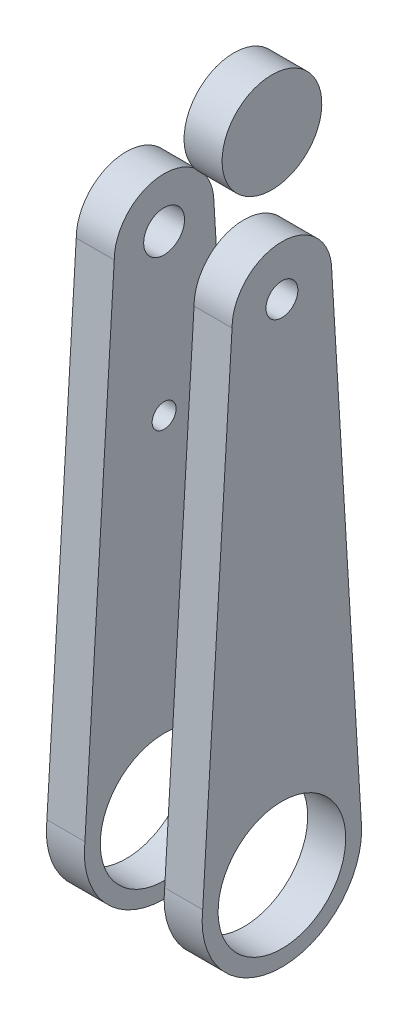
ISO-10303-21;
HEADER;
FILE_DESCRIPTION(('STEP AP214'),'2;1');
FILE_NAME('part.step','',(''),(''),'','','');
FILE_SCHEMA(('AUTOMOTIVE_DESIGN { 1 0 10303 214 1 1 1 1 }'));
ENDSEC;
DATA;
#1=APPLICATION_CONTEXT('core data for automotive mechanical design processes');
#2=APPLICATION_PROTOCOL_DEFINITION('international standard','automotive_design',2000,#1);
#3=PRODUCT_CONTEXT('',#1,'mechanical');
#4=PRODUCT('Part','Part','',(#3));
#5=PRODUCT_RELATED_PRODUCT_CATEGORY('part','',(#4));
#6=PRODUCT_DEFINITION_FORMATION('','',#4);
#7=PRODUCT_DEFINITION_CONTEXT('part definition',#1,'design');
#8=PRODUCT_DEFINITION('design','',#6,#7);
#9=PRODUCT_DEFINITION_SHAPE('','',#8);
#10=(LENGTH_UNIT() NAMED_UNIT(*) SI_UNIT(.MILLI.,.METRE.));
#11=(NAMED_UNIT(*) PLANE_ANGLE_UNIT() SI_UNIT($,.RADIAN.));
#12=(NAMED_UNIT(*) SI_UNIT($,.STERADIAN.) SOLID_ANGLE_UNIT());
#13=UNCERTAINTY_MEASURE_WITH_UNIT(LENGTH_MEASURE(1.E-05),#10,'distance_accuracy_value','');
#14=(GEOMETRIC_REPRESENTATION_CONTEXT(3) GLOBAL_UNCERTAINTY_ASSIGNED_CONTEXT((#13)) GLOBAL_UNIT_ASSIGNED_CONTEXT((#10,
#11,#12)) REPRESENTATION_CONTEXT('',''));
#15=CARTESIAN_POINT('',(0.,0.,0.));
#16=DIRECTION('',(0.,0.,1.));
#17=DIRECTION('',(1.,0.,0.));
#18=AXIS2_PLACEMENT_3D('',#15,#16,#17);
#19=CARTESIAN_POINT('',(-29.53,0.,45.));
#20=DIRECTION('',(1.,0.,0.));
#21=DIRECTION('',(0.,-1.,0.));
#22=AXIS2_PLACEMENT_3D('',#19,#20,#21);
#23=PLANE('',#22);
#24=CARTESIAN_POINT('',(-29.53,-50.0000000000001,20.));
#25=DIRECTION('',(1.,0.,0.));
#26=DIRECTION('',(0.,1.,0.));
#27=AXIS2_PLACEMENT_3D('',#24,#25,#26);
#28=CIRCLE('',#27,5.125);
#29=CARTESIAN_POINT('',(-29.53,-44.8750000000001,20.));
#30=VERTEX_POINT('',#29);
#31=EDGE_CURVE('E197',#30,#30,#28,.F.);
#32=ORIENTED_EDGE('',*,*,#31,.T.);
#33=EDGE_LOOP('',(#32));
#34=FACE_BOUND('',#33,.T.);
#35=CARTESIAN_POINT('',(-29.53,-90.,20.));
#36=DIRECTION('',(1.,0.,0.));
#37=DIRECTION('',(0.,1.,0.));
#38=AXIS2_PLACEMENT_3D('',#35,#36,#37);
#39=CIRCLE('',#38,3.);
#40=CARTESIAN_POINT('',(-29.53,-93.,20.));
#41=VERTEX_POINT('',#40);
#42=EDGE_CURVE('E157',#41,#41,#39,.T.);
#43=ORIENTED_EDGE('',*,*,#42,.F.);
#44=EDGE_LOOP('',(#43));
#45=FACE_BOUND('',#44,.T.);
#46=CARTESIAN_POINT('',(-29.5299999999998,-175.,20.));
#47=DIRECTION('',(1.,0.,0.));
#48=DIRECTION('',(0.,1.,0.));
#49=AXIS2_PLACEMENT_3D('',#46,#47,#48);
#50=CIRCLE('',#49,16.);
#51=CARTESIAN_POINT('',(-29.5299999999998,-159.,20.));
#52=VERTEX_POINT('',#51);
#53=EDGE_CURVE('E146',#52,#52,#50,.T.);
#54=ORIENTED_EDGE('',*,*,#53,.F.);
#55=EDGE_LOOP('',(#54));
#56=FACE_BOUND('',#55,.T.);
#57=DIRECTION('',(0.,0.998204845465778,0.0598922907279467));
#58=VECTOR('',#57,1.);
#59=CARTESIAN_POINT('',(-29.53,-0.627740135512173,10.4623355918693));
#60=LINE('',#59,#58);
#61=CARTESIAN_POINT('',(-29.5299999999998,-172.608609007573,0.143483459545651));
#62=VERTEX_POINT('',#61);
#63=CARTESIAN_POINT('',(-29.5299999999999,-50.,7.49999999999998));
#64=VERTEX_POINT('',#63);
#65=EDGE_CURVE('E130',#62,#64,#60,.T.);
#66=ORIENTED_EDGE('',*,*,#65,.T.);
#67=CARTESIAN_POINT('',(-29.5299999999999,-50.,20.));
#68=DIRECTION('',(1.,0.,0.));
#69=DIRECTION('',(0.,1.,0.));
#70=AXIS2_PLACEMENT_3D('',#67,#68,#69);
#71=CIRCLE('',#70,12.5);
#72=CARTESIAN_POINT('',(-29.53,-49.9999999999999,32.5));
#73=VERTEX_POINT('',#72);
#74=EDGE_CURVE('E140',#64,#73,#71,.T.);
#75=ORIENTED_EDGE('',*,*,#74,.T.);
#76=DIRECTION('',(0.,0.998204845465778,-0.0598922907279467));
#77=VECTOR('',#76,1.);
#78=CARTESIAN_POINT('',(-29.53,1.76365085691507,29.3941809485851));
#79=LINE('',#78,#77);
#80=CARTESIAN_POINT('',(-29.5299999999998,-172.608609007573,39.8565165404543));
#81=VERTEX_POINT('',#80);
#82=EDGE_CURVE('E143',#81,#73,#79,.T.);
#83=ORIENTED_EDGE('',*,*,#82,.F.);
#84=CARTESIAN_POINT('',(-29.5299999999998,-175.,20.));
#85=DIRECTION('',(1.,0.,0.));
#86=DIRECTION('',(0.,1.,0.));
#87=AXIS2_PLACEMENT_3D('',#84,#85,#86);
#88=CIRCLE('',#87,20.);
#89=EDGE_CURVE('E131',#81,#62,#88,.T.);
#90=ORIENTED_EDGE('',*,*,#89,.T.);
#91=EDGE_LOOP('',(#66,#75,#83,#90));
#92=FACE_BOUND('',#91,.T.);
#93=ADVANCED_FACE('F80',(#34,#45,#56,#92),#23,.T.);
#94=CARTESIAN_POINT('',(-29.5299999999998,-175.,20.));
#95=DIRECTION('',(-1.,0.,0.));
#96=DIRECTION('',(0.,1.,0.));
#97=AXIS2_PLACEMENT_3D('',#94,#95,#96);
#98=CYLINDRICAL_SURFACE('',#97,16.);
#99=CARTESIAN_POINT('',(-39.0599999999998,-175.,20.));
#100=DIRECTION('',(1.,0.,0.));
#101=DIRECTION('',(0.,1.,0.));
#102=AXIS2_PLACEMENT_3D('',#99,#100,#101);
#103=CIRCLE('',#102,16.);
#104=CARTESIAN_POINT('',(-39.0599999999998,-159.,20.));
#105=VERTEX_POINT('',#104);
#106=EDGE_CURVE('E145',#105,#105,#103,.T.);
#107=ORIENTED_EDGE('',*,*,#106,.F.);
#108=EDGE_LOOP('',(#107));
#109=FACE_BOUND('',#108,.T.);
#110=ORIENTED_EDGE('',*,*,#53,.T.);
#111=EDGE_LOOP('',(#110));
#112=FACE_BOUND('',#111,.T.);
#113=ADVANCED_FACE('F168',(#109,#112),#98,.F.);
#114=CARTESIAN_POINT('',(-29.53,1.76365085691507,29.3941809485851));
#115=DIRECTION('',(0.,-0.0598922907279466,-0.998204845465778));
#116=DIRECTION('',(0.,0.998204845465778,-0.0598922907279466));
#117=AXIS2_PLACEMENT_3D('',#114,#115,#116);
#118=PLANE('',#117);
#119=DIRECTION('',(0.,0.998204845465778,-0.0598922907279466));
#120=VECTOR('',#119,1.);
#121=CARTESIAN_POINT('',(-39.06,1.76365085691507,29.3941809485851));
#122=LINE('',#121,#120);
#123=CARTESIAN_POINT('',(-39.0599999999998,-172.608609007573,39.8565165404543));
#124=VERTEX_POINT('',#123);
#125=CARTESIAN_POINT('',(-39.06,-50.,32.5));
#126=VERTEX_POINT('',#125);
#127=EDGE_CURVE('E148',#124,#126,#122,.T.);
#128=ORIENTED_EDGE('',*,*,#127,.F.);
#129=DIRECTION('',(-1.,0.,0.));
#130=VECTOR('',#129,1.);
#131=CARTESIAN_POINT('',(-29.5299999999998,-172.608609007573,39.8565165404543));
#132=LINE('',#131,#130);
#133=EDGE_CURVE('E118',#81,#124,#132,.T.);
#134=ORIENTED_EDGE('',*,*,#133,.F.);
#135=ORIENTED_EDGE('',*,*,#82,.T.);
#136=DIRECTION('',(-1.,0.,0.));
#137=VECTOR('',#136,1.);
#138=CARTESIAN_POINT('',(-29.5299999999999,-50.,32.5));
#139=LINE('',#138,#137);
#140=EDGE_CURVE('E139',#73,#126,#139,.T.);
#141=ORIENTED_EDGE('',*,*,#140,.T.);
#142=EDGE_LOOP('',(#128,#134,#135,#141));
#143=FACE_BOUND('',#142,.T.);
#144=ADVANCED_FACE('F161',(#143),#118,.F.);
#145=CARTESIAN_POINT('',(-29.5299999999999,-50.,20.));
#146=DIRECTION('',(-1.,0.,0.));
#147=DIRECTION('',(0.,1.,0.));
#148=AXIS2_PLACEMENT_3D('',#145,#146,#147);
#149=CYLINDRICAL_SURFACE('',#148,12.5);
#150=DIRECTION('',(-1.,0.,0.));
#151=VECTOR('',#150,1.);
#152=CARTESIAN_POINT('',(-29.5299999999999,-50.,7.49999999999998));
#153=LINE('',#152,#151);
#154=CARTESIAN_POINT('',(-39.06,-50.0000000000001,7.50000000000003));
#155=VERTEX_POINT('',#154);
#156=EDGE_CURVE('E133',#64,#155,#153,.T.);
#157=ORIENTED_EDGE('',*,*,#156,.T.);
#158=CARTESIAN_POINT('',(-39.06,-50.,20.));
#159=DIRECTION('',(1.,0.,0.));
#160=DIRECTION('',(0.,1.,0.));
#161=AXIS2_PLACEMENT_3D('',#158,#159,#160);
#162=CIRCLE('',#161,12.5);
#163=EDGE_CURVE('E13',#155,#126,#162,.T.);
#164=ORIENTED_EDGE('',*,*,#163,.T.);
#165=ORIENTED_EDGE('',*,*,#140,.F.);
#166=ORIENTED_EDGE('',*,*,#74,.F.);
#167=EDGE_LOOP('',(#157,#164,#165,#166));
#168=FACE_BOUND('',#167,.T.);
#169=ADVANCED_FACE('F165',(#168),#149,.T.);
#170=CARTESIAN_POINT('',(-29.53,-0.627740135512173,10.4623355918693));
#171=DIRECTION('',(0.,0.0598922907279467,-0.998204845465778));
#172=DIRECTION('',(0.,0.998204845465778,0.0598922907279467));
#173=AXIS2_PLACEMENT_3D('',#170,#171,#172);
#174=PLANE('',#173);
#175=DIRECTION('',(-1.,0.,0.));
#176=VECTOR('',#175,1.);
#177=CARTESIAN_POINT('',(-29.5299999999998,-172.608609007573,0.143483459545651));
#178=LINE('',#177,#176);
#179=CARTESIAN_POINT('',(-39.0599999999998,-172.608609007573,0.143483459545624));
#180=VERTEX_POINT('',#179);
#181=EDGE_CURVE('E99',#62,#180,#178,.T.);
#182=ORIENTED_EDGE('',*,*,#181,.T.);
#183=DIRECTION('',(0.,0.998204845465778,0.0598922907279467));
#184=VECTOR('',#183,1.);
#185=CARTESIAN_POINT('',(-39.0599999999998,-172.608609007573,0.143483459545651));
#186=LINE('',#185,#184);
#187=EDGE_CURVE('E90',#180,#155,#186,.T.);
#188=ORIENTED_EDGE('',*,*,#187,.T.);
#189=ORIENTED_EDGE('',*,*,#156,.F.);
#190=ORIENTED_EDGE('',*,*,#65,.F.);
#191=EDGE_LOOP('',(#182,#188,#189,#190));
#192=FACE_BOUND('',#191,.T.);
#193=ADVANCED_FACE('F128',(#192),#174,.T.);
#194=CARTESIAN_POINT('',(-29.5299999999998,-175.,20.));
#195=DIRECTION('',(-1.,0.,0.));
#196=DIRECTION('',(0.,1.,0.));
#197=AXIS2_PLACEMENT_3D('',#194,#195,#196);
#198=CYLINDRICAL_SURFACE('',#197,20.);
#199=ORIENTED_EDGE('',*,*,#89,.F.);
#200=ORIENTED_EDGE('',*,*,#133,.T.);
#201=CARTESIAN_POINT('',(-39.0599999999998,-175.,20.));
#202=DIRECTION('',(1.,0.,0.));
#203=DIRECTION('',(0.,1.,0.));
#204=AXIS2_PLACEMENT_3D('',#201,#202,#203);
#205=CIRCLE('',#204,20.);
#206=EDGE_CURVE('E115',#124,#180,#205,.T.);
#207=ORIENTED_EDGE('',*,*,#206,.T.);
#208=ORIENTED_EDGE('',*,*,#181,.F.);
#209=EDGE_LOOP('',(#199,#200,#207,#208));
#210=FACE_BOUND('',#209,.T.);
#211=ADVANCED_FACE('F117',(#210),#198,.T.);
#212=CARTESIAN_POINT('',(-39.06,0.,45.));
#213=DIRECTION('',(-1.,0.,0.));
#214=DIRECTION('',(0.,1.,0.));
#215=AXIS2_PLACEMENT_3D('',#212,#213,#214);
#216=PLANE('',#215);
#217=CARTESIAN_POINT('',(-39.06,-50.0000000000001,20.));
#218=DIRECTION('',(-1.,0.,0.));
#219=DIRECTION('',(0.,-1.,0.));
#220=AXIS2_PLACEMENT_3D('',#217,#218,#219);
#221=CIRCLE('',#220,5.125);
#222=CARTESIAN_POINT('',(-39.0599999999999,-55.1250000000001,20.));
#223=VERTEX_POINT('',#222);
#224=EDGE_CURVE('E200',#223,#223,#221,.T.);
#225=ORIENTED_EDGE('',*,*,#224,.F.);
#226=EDGE_LOOP('',(#225));
#227=FACE_BOUND('',#226,.T.);
#228=CARTESIAN_POINT('',(-39.0599999999999,-90.,20.));
#229=DIRECTION('',(-1.,0.,0.));
#230=DIRECTION('',(0.,-1.,0.));
#231=AXIS2_PLACEMENT_3D('',#228,#229,#230);
#232=CIRCLE('',#231,3.);
#233=CARTESIAN_POINT('',(-39.0599999999999,-93.,20.));
#234=VERTEX_POINT('',#233);
#235=EDGE_CURVE('E84',#234,#234,#232,.T.);
#236=ORIENTED_EDGE('',*,*,#235,.F.);
#237=EDGE_LOOP('',(#236));
#238=FACE_BOUND('',#237,.T.);
#239=ORIENTED_EDGE('',*,*,#106,.T.);
#240=EDGE_LOOP('',(#239));
#241=FACE_BOUND('',#240,.T.);
#242=ORIENTED_EDGE('',*,*,#206,.F.);
#243=ORIENTED_EDGE('',*,*,#127,.T.);
#244=ORIENTED_EDGE('',*,*,#163,.F.);
#245=ORIENTED_EDGE('',*,*,#187,.F.);
#246=EDGE_LOOP('',(#242,#243,#244,#245));
#247=FACE_BOUND('',#246,.T.);
#248=ADVANCED_FACE('F82',(#227,#238,#241,#247),#216,.T.);
#249=CARTESIAN_POINT('',(1.38777878078145E-13,-89.9999999999999,20.));
#250=DIRECTION('',(-1.,0.,0.));
#251=DIRECTION('',(0.,-1.,0.));
#252=AXIS2_PLACEMENT_3D('',#249,#250,#251);
#253=CYLINDRICAL_SURFACE('',#252,3.);
#254=CARTESIAN_POINT('',(-29.53,-93.,20.));
#255=CARTESIAN_POINT('',(-29.6292708333333,-93.,20.));
#256=CARTESIAN_POINT('',(-29.7285416666666,-93.,20.));
#257=CARTESIAN_POINT('',(-29.9270833333333,-93.,20.));
#258=CARTESIAN_POINT('',(-30.0263541666666,-93.,20.));
#259=CARTESIAN_POINT('',(-30.2248958333333,-93.,20.));
#260=CARTESIAN_POINT('',(-30.3241666666666,-93.,20.));
#261=CARTESIAN_POINT('',(-30.5227083333333,-93.,20.));
#262=CARTESIAN_POINT('',(-30.6219791666666,-93.,20.));
#263=CARTESIAN_POINT('',(-30.8205208333333,-93.,20.));
#264=CARTESIAN_POINT('',(-30.9197916666666,-93.,20.));
#265=CARTESIAN_POINT('',(-31.1183333333333,-93.,20.));
#266=CARTESIAN_POINT('',(-31.2176041666666,-93.,20.));
#267=CARTESIAN_POINT('',(-31.4161458333333,-93.,20.));
#268=CARTESIAN_POINT('',(-31.5154166666666,-93.,20.));
#269=CARTESIAN_POINT('',(-31.7139583333333,-93.,20.));
#270=CARTESIAN_POINT('',(-31.8132291666666,-93.,20.));
#271=CARTESIAN_POINT('',(-32.0117708333333,-93.,20.));
#272=CARTESIAN_POINT('',(-32.1110416666666,-93.,20.));
#273=CARTESIAN_POINT('',(-32.3095833333333,-93.,20.));
#274=CARTESIAN_POINT('',(-32.4088541666666,-93.,20.));
#275=CARTESIAN_POINT('',(-32.6073958333333,-93.,20.));
#276=CARTESIAN_POINT('',(-32.7066666666666,-93.,20.));
#277=CARTESIAN_POINT('',(-32.9052083333333,-93.,20.));
#278=CARTESIAN_POINT('',(-33.0044791666666,-93.,20.));
#279=CARTESIAN_POINT('',(-33.2030208333333,-93.,20.));
#280=CARTESIAN_POINT('',(-33.3022916666666,-93.,20.));
#281=CARTESIAN_POINT('',(-33.5008333333333,-93.,20.));
#282=CARTESIAN_POINT('',(-33.6001041666666,-93.,20.));
#283=CARTESIAN_POINT('',(-33.7986458333333,-93.,20.));
#284=CARTESIAN_POINT('',(-33.8979166666666,-93.,20.));
#285=CARTESIAN_POINT('',(-34.0964583333333,-93.,20.));
#286=CARTESIAN_POINT('',(-34.1957291666666,-93.,20.));
#287=CARTESIAN_POINT('',(-34.3942708333333,-93.,20.));
#288=CARTESIAN_POINT('',(-34.4935416666666,-93.,20.));
#289=CARTESIAN_POINT('',(-34.6920833333333,-93.,20.));
#290=CARTESIAN_POINT('',(-34.7913541666666,-93.,20.));
#291=CARTESIAN_POINT('',(-34.9898958333333,-93.,20.));
#292=CARTESIAN_POINT('',(-35.0891666666666,-93.,20.));
#293=CARTESIAN_POINT('',(-35.2877083333333,-93.,20.));
#294=CARTESIAN_POINT('',(-35.3869791666666,-93.,20.));
#295=CARTESIAN_POINT('',(-35.5855208333333,-93.,20.));
#296=CARTESIAN_POINT('',(-35.6847916666666,-93.,20.));
#297=CARTESIAN_POINT('',(-35.8833333333332,-93.,20.));
#298=CARTESIAN_POINT('',(-35.9826041666666,-93.,20.));
#299=CARTESIAN_POINT('',(-36.1811458333332,-93.,20.));
#300=CARTESIAN_POINT('',(-36.2804166666666,-93.,20.));
#301=CARTESIAN_POINT('',(-36.4789583333332,-93.,20.));
#302=CARTESIAN_POINT('',(-36.5782291666666,-93.,20.));
#303=CARTESIAN_POINT('',(-36.7767708333332,-93.,20.));
#304=CARTESIAN_POINT('',(-36.8760416666666,-93.,20.));
#305=CARTESIAN_POINT('',(-37.0745833333332,-93.,20.));
#306=CARTESIAN_POINT('',(-37.1738541666666,-93.,20.));
#307=CARTESIAN_POINT('',(-37.3723958333332,-93.,20.));
#308=CARTESIAN_POINT('',(-37.4716666666666,-93.,20.));
#309=CARTESIAN_POINT('',(-37.6702083333332,-93.,20.));
#310=CARTESIAN_POINT('',(-37.7694791666666,-93.,20.));
#311=CARTESIAN_POINT('',(-37.9680208333332,-93.,20.));
#312=CARTESIAN_POINT('',(-38.0672916666666,-93.,20.));
#313=CARTESIAN_POINT('',(-38.2658333333332,-93.,20.));
#314=CARTESIAN_POINT('',(-38.3651041666666,-93.,20.));
#315=CARTESIAN_POINT('',(-38.5636458333332,-93.,20.));
#316=CARTESIAN_POINT('',(-38.6629166666666,-93.,20.));
#317=CARTESIAN_POINT('',(-38.8614583333332,-93.,20.));
#318=CARTESIAN_POINT('',(-38.9607291666666,-93.,20.));
#319=CARTESIAN_POINT('',(-39.0599999999999,-93.,20.));
#320=B_SPLINE_CURVE_WITH_KNOTS('',3,(#254,#255,#256,#257,#258,#259,#260,#261,#262,#263,#264,
#265,#266,#267,#268,#269,#270,#271,#272,#273,#274,#275,#276,#277,#278,#279,#280,#281,#282,#283,
#284,#285,#286,#287,#288,#289,#290,#291,#292,#293,#294,#295,#296,#297,#298,#299,#300,#301,#302,
#303,#304,#305,#306,#307,#308,#309,#310,#311,#312,#313,#314,#315,#316,#317,#318,#319),
.UNSPECIFIED.,.F.,.F.,(4,2,2,2,2,2,2,2,2,2,2,2,2,2,2,2,2,2,2,2,2,2,2,2,2,2,2,2,2,2,2,2,4),(0.,
0.297812499999998,0.595624999999995,0.893437499999993,1.19124999999999,1.48906249999999,
1.78687499999998,2.08468749999998,2.38249999999998,2.68031249999997,2.97812499999997,
3.27593749999998,3.57374999999997,3.87156249999996,4.16937499999996,4.46718749999997,
4.76499999999996,5.06281249999995,5.36062499999996,5.65843749999996,5.95624999999995,
6.25406249999995,6.55187499999995,6.84968749999995,7.14749999999994,7.44531249999994,
7.74312499999994,8.04093749999994,8.33874999999993,8.63656249999993,8.93437499999993,
9.23218749999993,9.52999999999992),.UNSPECIFIED.);
#321=EDGE_CURVE('BSEAM186',#41,#234,#320,.T.);
#322=ORIENTED_EDGE('',*,*,#42,.T.);
#323=ORIENTED_EDGE('',*,*,#235,.T.);
#324=ORIENTED_EDGE('',*,*,#321,.T.);
#325=ORIENTED_EDGE('',*,*,#321,.F.);
#326=EDGE_LOOP('',(#322,#324,#323,#325));
#327=FACE_BOUND('',#326,.T.);
#328=ADVANCED_FACE('F186',(#327),#253,.F.);
#329=CARTESIAN_POINT('',(0.00100000000007039,-50.,20.));
#330=DIRECTION('',(-1.,0.,0.));
#331=DIRECTION('',(0.,-1.,0.));
#332=AXIS2_PLACEMENT_3D('',#329,#330,#331);
#333=CYLINDRICAL_SURFACE('',#332,5.125);
#334=ORIENTED_EDGE('',*,*,#31,.F.);
#335=EDGE_LOOP('',(#334));
#336=FACE_BOUND('',#335,.T.);
#337=ORIENTED_EDGE('',*,*,#224,.T.);
#338=EDGE_LOOP('',(#337));
#339=FACE_BOUND('',#338,.T.);
#340=ADVANCED_FACE('F189',(#336,#339),#333,.F.);
#341=CLOSED_SHELL('',(#93,#113,#144,#169,#193,#211,#248,#328,#340));
#342=MANIFOLD_SOLID_BREP('B2',#341);
#343=CARTESIAN_POINT('',(-9.53000000000002,0.,45.));
#344=DIRECTION('',(-1.,0.,0.));
#345=DIRECTION('',(0.,-1.,0.));
#346=AXIS2_PLACEMENT_3D('',#343,#344,#345);
#347=PLANE('',#346);
#348=CARTESIAN_POINT('',(-9.53000000000004,-50.,20.));
#349=DIRECTION('',(1.,0.,0.));
#350=DIRECTION('',(0.,1.,0.));
#351=AXIS2_PLACEMENT_3D('',#348,#349,#350);
#352=CIRCLE('',#351,4.);
#353=CARTESIAN_POINT('',(-9.53000000000004,-46.,20.));
#354=VERTEX_POINT('',#353);
#355=EDGE_CURVE('E366',#354,#354,#352,.T.);
#356=ORIENTED_EDGE('',*,*,#355,.T.);
#357=EDGE_LOOP('',(#356));
#358=FACE_BOUND('',#357,.T.);
#359=CARTESIAN_POINT('',(-9.53000000000002,-175.,20.));
#360=DIRECTION('',(1.,0.,0.));
#361=DIRECTION('',(0.,1.,0.));
#362=AXIS2_PLACEMENT_3D('',#359,#360,#361);
#363=CIRCLE('',#362,16.);
#364=CARTESIAN_POINT('',(-9.53000000000003,-159.,20.));
#365=VERTEX_POINT('',#364);
#366=EDGE_CURVE('E353',#365,#365,#363,.T.);
#367=ORIENTED_EDGE('',*,*,#366,.T.);
#368=EDGE_LOOP('',(#367));
#369=FACE_BOUND('',#368,.T.);
#370=DIRECTION('',(0.,0.998204845465779,0.0598922907279467));
#371=VECTOR('',#370,1.);
#372=CARTESIAN_POINT('',(-9.53000000000005,-0.627740135512157,10.4623355918693));
#373=LINE('',#372,#371);
#374=CARTESIAN_POINT('',(-9.53000000000002,-172.608609007573,0.143483459545633));
#375=VERTEX_POINT('',#374);
#376=CARTESIAN_POINT('',(-9.53000000000004,-50.,7.5));
#377=VERTEX_POINT('',#376);
#378=EDGE_CURVE('E343',#375,#377,#373,.T.);
#379=ORIENTED_EDGE('',*,*,#378,.F.);
#380=CARTESIAN_POINT('',(-9.53000000000002,-175.,20.));
#381=DIRECTION('',(1.,0.,0.));
#382=DIRECTION('',(0.,1.,0.));
#383=AXIS2_PLACEMENT_3D('',#380,#381,#382);
#384=CIRCLE('',#383,20.);
#385=CARTESIAN_POINT('',(-9.53000000000002,-172.608609007573,39.8565165404544));
#386=VERTEX_POINT('',#385);
#387=EDGE_CURVE('E303',#386,#375,#384,.T.);
#388=ORIENTED_EDGE('',*,*,#387,.F.);
#389=DIRECTION('',(0.,0.998204845465779,-0.0598922907279467));
#390=VECTOR('',#389,1.);
#391=CARTESIAN_POINT('',(-9.53000000000005,1.7636508569151,29.3941809485851));
#392=LINE('',#391,#390);
#393=CARTESIAN_POINT('',(-9.52999999999997,-49.9999999999999,32.5));
#394=VERTEX_POINT('',#393);
#395=EDGE_CURVE('E350',#386,#394,#392,.T.);
#396=ORIENTED_EDGE('',*,*,#395,.T.);
#397=CARTESIAN_POINT('',(-9.53000000000004,-50.,20.));
#398=DIRECTION('',(1.,0.,0.));
#399=DIRECTION('',(0.,1.,0.));
#400=AXIS2_PLACEMENT_3D('',#397,#398,#399);
#401=CIRCLE('',#400,12.5);
#402=EDGE_CURVE('E346',#377,#394,#401,.T.);
#403=ORIENTED_EDGE('',*,*,#402,.F.);
#404=EDGE_LOOP('',(#379,#388,#396,#403));
#405=FACE_BOUND('',#404,.T.);
#406=ADVANCED_FACE('F286',(#358,#369,#405),#347,.T.);
#407=CARTESIAN_POINT('',(-9.53000000000002,-175.,20.));
#408=DIRECTION('',(1.,0.,0.));
#409=DIRECTION('',(0.,1.,0.));
#410=AXIS2_PLACEMENT_3D('',#407,#408,#409);
#411=CYLINDRICAL_SURFACE('',#410,16.);
#412=CARTESIAN_POINT('',(0.,-175.,20.));
#413=DIRECTION('',(1.,0.,0.));
#414=DIRECTION('',(0.,1.,0.));
#415=AXIS2_PLACEMENT_3D('',#412,#413,#414);
#416=CIRCLE('',#415,16.);
#417=CARTESIAN_POINT('',(0.,-159.,20.));
#418=VERTEX_POINT('',#417);
#419=EDGE_CURVE('E352',#418,#418,#416,.T.);
#420=ORIENTED_EDGE('',*,*,#419,.T.);
#421=EDGE_LOOP('',(#420));
#422=FACE_BOUND('',#421,.T.);
#423=ORIENTED_EDGE('',*,*,#366,.F.);
#424=EDGE_LOOP('',(#423));
#425=FACE_BOUND('',#424,.T.);
#426=ADVANCED_FACE('F376',(#422,#425),#411,.F.);
#427=CARTESIAN_POINT('',(-9.53000000000005,1.7636508569151,29.3941809485851));
#428=DIRECTION('',(0.,-0.0598922907279467,-0.998204845465779));
#429=DIRECTION('',(0.,0.998204845465779,-0.0598922907279467));
#430=AXIS2_PLACEMENT_3D('',#427,#428,#429);
#431=PLANE('',#430);
#432=DIRECTION('',(0.,0.998204845465779,-0.0598922907279467));
#433=VECTOR('',#432,1.);
#434=CARTESIAN_POINT('',(0.,1.7636508569151,29.3941809485851));
#435=LINE('',#434,#433);
#436=CARTESIAN_POINT('',(0.,-172.608609007573,39.8565165404544));
#437=VERTEX_POINT('',#436);
#438=CARTESIAN_POINT('',(0.,-50.,32.5));
#439=VERTEX_POINT('',#438);
#440=EDGE_CURVE('E325',#437,#439,#435,.T.);
#441=ORIENTED_EDGE('',*,*,#440,.T.);
#442=DIRECTION('',(1.,0.,0.));
#443=VECTOR('',#442,1.);
#444=CARTESIAN_POINT('',(-9.53000000000004,-50.,32.5));
#445=LINE('',#444,#443);
#446=EDGE_CURVE('E345',#394,#439,#445,.T.);
#447=ORIENTED_EDGE('',*,*,#446,.F.);
#448=ORIENTED_EDGE('',*,*,#395,.F.);
#449=DIRECTION('',(1.,0.,0.));
#450=VECTOR('',#449,1.);
#451=CARTESIAN_POINT('',(-9.53000000000002,-172.608609007573,39.8565165404544));
#452=LINE('',#451,#450);
#453=EDGE_CURVE('E349',#386,#437,#452,.T.);
#454=ORIENTED_EDGE('',*,*,#453,.T.);
#455=EDGE_LOOP('',(#441,#447,#448,#454));
#456=FACE_BOUND('',#455,.T.);
#457=ADVANCED_FACE('F373',(#456),#431,.F.);
#458=CARTESIAN_POINT('',(-9.53000000000004,-50.,20.));
#459=DIRECTION('',(1.,0.,0.));
#460=DIRECTION('',(0.,1.,0.));
#461=AXIS2_PLACEMENT_3D('',#458,#459,#460);
#462=CYLINDRICAL_SURFACE('',#461,12.5);
#463=DIRECTION('',(1.,0.,0.));
#464=VECTOR('',#463,1.);
#465=CARTESIAN_POINT('',(-9.53000000000004,-50.,7.5));
#466=LINE('',#465,#464);
#467=CARTESIAN_POINT('',(0.,-50.0000000000002,7.50000000000001));
#468=VERTEX_POINT('',#467);
#469=EDGE_CURVE('E334',#377,#468,#466,.T.);
#470=ORIENTED_EDGE('',*,*,#469,.F.);
#471=ORIENTED_EDGE('',*,*,#402,.T.);
#472=ORIENTED_EDGE('',*,*,#446,.T.);
#473=CARTESIAN_POINT('',(0.,-50.,20.));
#474=DIRECTION('',(1.,0.,0.));
#475=DIRECTION('',(0.,1.,0.));
#476=AXIS2_PLACEMENT_3D('',#473,#474,#475);
#477=CIRCLE('',#476,12.5);
#478=EDGE_CURVE('E78',#468,#439,#477,.T.);
#479=ORIENTED_EDGE('',*,*,#478,.F.);
#480=EDGE_LOOP('',(#470,#471,#472,#479));
#481=FACE_BOUND('',#480,.T.);
#482=ADVANCED_FACE('F370',(#481),#462,.T.);
#483=CARTESIAN_POINT('',(-9.53000000000005,-0.627740135512157,10.4623355918693));
#484=DIRECTION('',(0.,0.0598922907279467,-0.998204845465779));
#485=DIRECTION('',(0.,0.998204845465779,0.0598922907279467));
#486=AXIS2_PLACEMENT_3D('',#483,#484,#485);
#487=PLANE('',#486);
#488=DIRECTION('',(1.,0.,0.));
#489=VECTOR('',#488,1.);
#490=CARTESIAN_POINT('',(-9.53000000000002,-172.608609007573,0.143483459545633));
#491=LINE('',#490,#489);
#492=CARTESIAN_POINT('',(0.,-172.608609007573,0.143483459545659));
#493=VERTEX_POINT('',#492);
#494=EDGE_CURVE('E331',#375,#493,#491,.T.);
#495=ORIENTED_EDGE('',*,*,#494,.F.);
#496=ORIENTED_EDGE('',*,*,#378,.T.);
#497=ORIENTED_EDGE('',*,*,#469,.T.);
#498=DIRECTION('',(0.,0.998204845465779,0.0598922907279467));
#499=VECTOR('',#498,1.);
#500=CARTESIAN_POINT('',(0.,-172.608609007573,0.143483459545651));
#501=LINE('',#500,#499);
#502=EDGE_CURVE('E290',#493,#468,#501,.T.);
#503=ORIENTED_EDGE('',*,*,#502,.F.);
#504=EDGE_LOOP('',(#495,#496,#497,#503));
#505=FACE_BOUND('',#504,.T.);
#506=ADVANCED_FACE('F330',(#505),#487,.T.);
#507=CARTESIAN_POINT('',(-9.53000000000002,-175.,20.));
#508=DIRECTION('',(1.,0.,0.));
#509=DIRECTION('',(0.,1.,0.));
#510=AXIS2_PLACEMENT_3D('',#507,#508,#509);
#511=CYLINDRICAL_SURFACE('',#510,20.);
#512=ORIENTED_EDGE('',*,*,#387,.T.);
#513=ORIENTED_EDGE('',*,*,#494,.T.);
#514=CARTESIAN_POINT('',(0.,-175.,20.));
#515=DIRECTION('',(1.,0.,0.));
#516=DIRECTION('',(0.,1.,0.));
#517=AXIS2_PLACEMENT_3D('',#514,#515,#516);
#518=CIRCLE('',#517,20.);
#519=EDGE_CURVE('E323',#437,#493,#518,.T.);
#520=ORIENTED_EDGE('',*,*,#519,.F.);
#521=ORIENTED_EDGE('',*,*,#453,.F.);
#522=EDGE_LOOP('',(#512,#513,#520,#521));
#523=FACE_BOUND('',#522,.T.);
#524=ADVANCED_FACE('F335',(#523),#511,.T.);
#525=CARTESIAN_POINT('',(-9.53000000000004,-50.,20.));
#526=DIRECTION('',(1.,0.,0.));
#527=DIRECTION('',(0.,1.,0.));
#528=AXIS2_PLACEMENT_3D('',#525,#526,#527);
#529=CYLINDRICAL_SURFACE('',#528,4.);
#530=CARTESIAN_POINT('',(0.,-50.,20.));
#531=DIRECTION('',(1.,0.,0.));
#532=DIRECTION('',(0.,1.,0.));
#533=AXIS2_PLACEMENT_3D('',#530,#531,#532);
#534=CIRCLE('',#533,4.);
#535=CARTESIAN_POINT('',(0.,-46.,20.));
#536=VERTEX_POINT('',#535);
#537=EDGE_CURVE('E326',#536,#536,#534,.T.);
#538=ORIENTED_EDGE('',*,*,#537,.T.);
#539=EDGE_LOOP('',(#538));
#540=FACE_BOUND('',#539,.T.);
#541=ORIENTED_EDGE('',*,*,#355,.F.);
#542=EDGE_LOOP('',(#541));
#543=FACE_BOUND('',#542,.T.);
#544=ADVANCED_FACE('F392',(#540,#543),#529,.F.);
#545=CARTESIAN_POINT('',(0.,0.,45.));
#546=DIRECTION('',(1.,0.,0.));
#547=DIRECTION('',(0.,1.,0.));
#548=AXIS2_PLACEMENT_3D('',#545,#546,#547);
#549=PLANE('',#548);
#550=ORIENTED_EDGE('',*,*,#537,.F.);
#551=EDGE_LOOP('',(#550));
#552=FACE_BOUND('',#551,.T.);
#553=ORIENTED_EDGE('',*,*,#419,.F.);
#554=EDGE_LOOP('',(#553));
#555=FACE_BOUND('',#554,.T.);
#556=ORIENTED_EDGE('',*,*,#519,.T.);
#557=ORIENTED_EDGE('',*,*,#502,.T.);
#558=ORIENTED_EDGE('',*,*,#478,.T.);
#559=ORIENTED_EDGE('',*,*,#440,.F.);
#560=EDGE_LOOP('',(#556,#557,#558,#559));
#561=FACE_BOUND('',#560,.T.);
#562=ADVANCED_FACE('F288',(#552,#555,#561),#549,.T.);
#563=CLOSED_SHELL('',(#406,#426,#457,#482,#506,#524,#544,#562));
#564=MANIFOLD_SOLID_BREP('B7_NOT_SHOWN',#563);
#565=CARTESIAN_POINT('',(-9.53000000000002,0.,45.));
#566=DIRECTION('',(-1.,0.,0.));
#567=DIRECTION('',(0.,-1.,0.));
#568=AXIS2_PLACEMENT_3D('',#565,#566,#567);
#569=PLANE('',#568);
#570=CARTESIAN_POINT('',(-9.53000000000004,-12.5,22.5));
#571=DIRECTION('',(1.,0.,0.));
#572=DIRECTION('',(0.,1.,0.));
#573=AXIS2_PLACEMENT_3D('',#570,#571,#572);
#574=CIRCLE('',#573,12.5);
#575=CARTESIAN_POINT('',(-9.53000000000005,0.,22.5));
#576=VERTEX_POINT('',#575);
#577=EDGE_CURVE('E483',#576,#576,#574,.T.);
#578=ORIENTED_EDGE('',*,*,#577,.F.);
#579=EDGE_LOOP('',(#578));
#580=FACE_BOUND('',#579,.T.);
#581=ADVANCED_FACE('F476',(#580),#569,.T.);
#582=CARTESIAN_POINT('',(-9.53000000000004,-12.5,22.5));
#583=DIRECTION('',(1.,0.,0.));
#584=DIRECTION('',(0.,1.,0.));
#585=AXIS2_PLACEMENT_3D('',#582,#583,#584);
#586=CYLINDRICAL_SURFACE('',#585,12.5);
#587=CARTESIAN_POINT('',(0.,-12.5,22.5));
#588=DIRECTION('',(1.,0.,0.));
#589=DIRECTION('',(0.,1.,0.));
#590=AXIS2_PLACEMENT_3D('',#587,#588,#589);
#591=CIRCLE('',#590,12.5);
#592=CARTESIAN_POINT('',(0.,0.,22.5));
#593=VERTEX_POINT('',#592);
#594=EDGE_CURVE('E285',#593,#593,#591,.T.);
#595=ORIENTED_EDGE('',*,*,#594,.F.);
#596=EDGE_LOOP('',(#595));
#597=FACE_BOUND('',#596,.T.);
#598=ORIENTED_EDGE('',*,*,#577,.T.);
#599=EDGE_LOOP('',(#598));
#600=FACE_BOUND('',#599,.T.);
#601=ADVANCED_FACE('F489',(#597,#600),#586,.T.);
#602=CARTESIAN_POINT('',(0.,0.,45.));
#603=DIRECTION('',(1.,0.,0.));
#604=DIRECTION('',(0.,1.,0.));
#605=AXIS2_PLACEMENT_3D('',#602,#603,#604);
#606=PLANE('',#605);
#607=ORIENTED_EDGE('',*,*,#594,.T.);
#608=EDGE_LOOP('',(#607));
#609=FACE_BOUND('',#608,.T.);
#610=ADVANCED_FACE('F478',(#609),#606,.T.);
#611=CLOSED_SHELL('',(#581,#601,#610));
#612=MANIFOLD_SOLID_BREP('B72_NOT_SHOWN',#611);
#613=ADVANCED_BREP_SHAPE_REPRESENTATION('',(#18,#342,#564,#612),#14);
#614=SHAPE_DEFINITION_REPRESENTATION(#9,#613);
ENDSEC;
END-ISO-10303-21;
